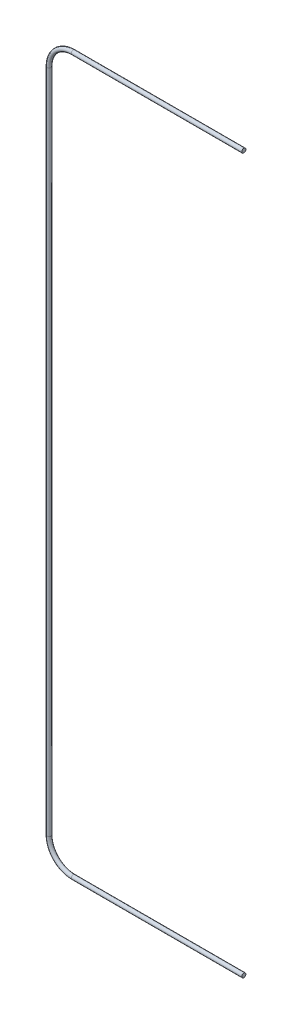
ISO-10303-21;
HEADER;
FILE_DESCRIPTION(('STEP AP214'),'2;1');
FILE_NAME('part.step','',(''),(''),'','','');
FILE_SCHEMA(('AUTOMOTIVE_DESIGN { 1 0 10303 214 1 1 1 1 }'));
ENDSEC;
DATA;
#1=APPLICATION_CONTEXT('core data for automotive mechanical design processes');
#2=APPLICATION_PROTOCOL_DEFINITION('international standard','automotive_design',2000,#1);
#3=PRODUCT_CONTEXT('',#1,'mechanical');
#4=PRODUCT('Part','Part','',(#3));
#5=PRODUCT_RELATED_PRODUCT_CATEGORY('part','',(#4));
#6=PRODUCT_DEFINITION_FORMATION('','',#4);
#7=PRODUCT_DEFINITION_CONTEXT('part definition',#1,'design');
#8=PRODUCT_DEFINITION('design','',#6,#7);
#9=PRODUCT_DEFINITION_SHAPE('','',#8);
#10=(LENGTH_UNIT() NAMED_UNIT(*) SI_UNIT(.MILLI.,.METRE.));
#11=(NAMED_UNIT(*) PLANE_ANGLE_UNIT() SI_UNIT($,.RADIAN.));
#12=(NAMED_UNIT(*) SI_UNIT($,.STERADIAN.) SOLID_ANGLE_UNIT());
#13=UNCERTAINTY_MEASURE_WITH_UNIT(LENGTH_MEASURE(1.E-05),#10,'distance_accuracy_value','');
#14=(GEOMETRIC_REPRESENTATION_CONTEXT(3) GLOBAL_UNCERTAINTY_ASSIGNED_CONTEXT((#13)) GLOBAL_UNIT_ASSIGNED_CONTEXT((#10,
#11,#12)) REPRESENTATION_CONTEXT('',''));
#15=CARTESIAN_POINT('',(0.,0.,0.));
#16=DIRECTION('',(0.,0.,1.));
#17=DIRECTION('',(1.,0.,0.));
#18=AXIS2_PLACEMENT_3D('',#15,#16,#17);
#19=CARTESIAN_POINT('',(599.999999999852,1099.99999999999,4.27435864480685E-11));
#20=DIRECTION('',(0.999999999999924,0.,0.));
#21=DIRECTION('',(0.,0.,0.99999999999992));
#22=AXIS2_PLACEMENT_3D('',#19,#20,#21);
#23=PLANE('',#22);
#24=CARTESIAN_POINT('',(599.999999999852,1099.99999999999,4.27435864480685E-11));
#25=DIRECTION('',(0.999999999999924,0.,0.));
#26=DIRECTION('',(0.,0.,0.99999999999992));
#27=AXIS2_PLACEMENT_3D('',#24,#25,#26);
#28=CIRCLE('',#27,6.35);
#29=CARTESIAN_POINT('',(599.999999999852,1099.99999999999,6.35000000004223));
#30=VERTEX_POINT('',#29);
#31=EDGE_CURVE('E77',#30,#30,#28,.T.);
#32=ORIENTED_EDGE('',*,*,#31,.T.);
#33=EDGE_LOOP('',(#32));
#34=FACE_BOUND('',#33,.T.);
#35=ADVANCED_FACE('F48',(#34),#23,.T.);
#36=CARTESIAN_POINT('',(599.999999999934,-1099.99999999999,-1.17350573702879E-10));
#37=DIRECTION('',(-0.999999999999924,0.,0.));
#38=DIRECTION('',(0.,0.,0.99999999999992));
#39=AXIS2_PLACEMENT_3D('',#36,#37,#38);
#40=PLANE('',#39);
#41=CARTESIAN_POINT('',(599.999999999934,-1099.99999999999,-1.17350573702879E-10));
#42=DIRECTION('',(-0.999999999999924,0.,0.));
#43=DIRECTION('',(0.,0.,0.99999999999992));
#44=AXIS2_PLACEMENT_3D('',#41,#42,#43);
#45=CIRCLE('',#44,6.35);
#46=CARTESIAN_POINT('',(599.999999999934,-1099.99999999999,6.34999999988214));
#47=VERTEX_POINT('',#46);
#48=EDGE_CURVE('E11',#47,#47,#45,.T.);
#49=ORIENTED_EDGE('',*,*,#48,.F.);
#50=EDGE_LOOP('',(#49));
#51=FACE_BOUND('',#50,.T.);
#52=ADVANCED_FACE('F87',(#51),#40,.F.);
#53=CARTESIAN_POINT('',(599.999999999852,1099.99999999999,4.27435864480685E-11));
#54=DIRECTION('',(-0.999999999999924,0.,0.));
#55=DIRECTION('',(0.,0.,0.99999999999992));
#56=AXIS2_PLACEMENT_3D('',#53,#54,#55);
#57=CYLINDRICAL_SURFACE('',#56,6.35);
#58=CARTESIAN_POINT('',(74.9999999998856,1099.99999999999,7.91589016557737E-11));
#59=DIRECTION('',(0.999999999999924,0.,0.));
#60=DIRECTION('',(0.,0.,0.99999999999992));
#61=AXIS2_PLACEMENT_3D('',#58,#59,#60);
#62=CIRCLE('',#61,6.35);
#63=CARTESIAN_POINT('',(74.9999999998851,1106.35000000001,8.06910834446281E-11));
#64=VERTEX_POINT('',#63);
#65=EDGE_CURVE('E73',#64,#64,#62,.T.);
#66=ORIENTED_EDGE('',*,*,#65,.T.);
#67=EDGE_LOOP('',(#66));
#68=FACE_BOUND('',#67,.T.);
#69=ORIENTED_EDGE('',*,*,#31,.F.);
#70=EDGE_LOOP('',(#69));
#71=FACE_BOUND('',#70,.T.);
#72=ADVANCED_FACE('F84',(#68,#71),#57,.T.);
#73=CARTESIAN_POINT('',(74.9999999998909,1025.00000000001,6.10622663543836E-11));
#74=DIRECTION('',(0.,0.,0.99999999999992));
#75=DIRECTION('',(0.999999999999924,0.,0.));
#76=AXIS2_PLACEMENT_3D('',#73,#74,#75);
#77=TOROIDAL_SURFACE('',#76,75.,6.35);
#78=CARTESIAN_POINT('',(-8.70414851306123E-11,1025.00000000001,5.57331958361829E-11));
#79=DIRECTION('',(0.,1.00000000000001,0.));
#80=DIRECTION('',(0.,0.,0.99999999999992));
#81=AXIS2_PLACEMENT_3D('',#78,#79,#80);
#82=CIRCLE('',#81,6.35);
#83=CARTESIAN_POINT('',(-6.35000000010902,1025.00000000001,5.52820011989735E-11));
#84=VERTEX_POINT('',#83);
#85=EDGE_CURVE('E67',#84,#84,#82,.T.);
#86=CARTESIAN_POINT('',(74.9999999998909,1025.00000000001,6.10622663543836E-11));
#87=DIRECTION('',(0.,0.,0.99999999999992));
#88=DIRECTION('',(0.999999999999924,0.,0.));
#89=AXIS2_PLACEMENT_3D('',#86,#87,#88);
#90=CIRCLE('',#89,81.35);
#91=EDGE_CURVE('',#64,#84,#90,.T.);
#92=ORIENTED_EDGE('',*,*,#65,.F.);
#93=ORIENTED_EDGE('',*,*,#85,.T.);
#94=ORIENTED_EDGE('',*,*,#91,.T.);
#95=ORIENTED_EDGE('',*,*,#91,.F.);
#96=EDGE_LOOP('',(#92,#94,#93,#95));
#97=FACE_BOUND('',#96,.T.);
#98=ADVANCED_FACE('F86',(#97),#77,.T.);
#99=CARTESIAN_POINT('',(-8.70414851306123E-11,1025.00000000001,5.57331958361829E-11));
#100=DIRECTION('',(0.,-1.00000000000001,0.));
#101=DIRECTION('',(0.,0.,-0.99999999999992));
#102=AXIS2_PLACEMENT_3D('',#99,#100,#101);
#103=CYLINDRICAL_SURFACE('',#102,6.35);
#104=CARTESIAN_POINT('',(-3.10862446895044E-11,-1024.99999999999,-8.58202398035246E-11));
#105=DIRECTION('',(0.,1.00000000000001,0.));
#106=DIRECTION('',(0.,0.,0.99999999999992));
#107=AXIS2_PLACEMENT_3D('',#104,#105,#106);
#108=CIRCLE('',#107,6.35);
#109=CARTESIAN_POINT('',(-6.35000000003623,-1024.99999999999,-8.58578393566253E-11));
#110=VERTEX_POINT('',#109);
#111=EDGE_CURVE('E61',#110,#110,#108,.T.);
#112=ORIENTED_EDGE('',*,*,#111,.T.);
#113=EDGE_LOOP('',(#112));
#114=FACE_BOUND('',#113,.T.);
#115=ORIENTED_EDGE('',*,*,#85,.F.);
#116=EDGE_LOOP('',(#115));
#117=FACE_BOUND('',#116,.T.);
#118=ADVANCED_FACE('F94',(#114,#117),#103,.T.);
#119=CARTESIAN_POINT('',(74.9999999999638,-1024.99999999999,-8.53761505936745E-11));
#120=DIRECTION('',(0.,0.,0.99999999999992));
#121=DIRECTION('',(0.999999999999924,0.,0.));
#122=AXIS2_PLACEMENT_3D('',#119,#120,#121);
#123=TOROIDAL_SURFACE('',#122,75.,6.35);
#124=CARTESIAN_POINT('',(74.9999999999762,-1099.99999999999,-9.78106484694763E-11));
#125=DIRECTION('',(-0.999999999999924,0.,0.));
#126=DIRECTION('',(0.,0.,0.99999999999992));
#127=AXIS2_PLACEMENT_3D('',#124,#125,#126);
#128=CIRCLE('',#127,6.35);
#129=CARTESIAN_POINT('',(74.9999999999772,-1106.34999999999,-9.88634359562928E-11));
#130=VERTEX_POINT('',#129);
#131=EDGE_CURVE('E55',#130,#130,#128,.T.);
#132=CARTESIAN_POINT('',(74.9999999999638,-1024.99999999999,-8.53761505936745E-11));
#133=DIRECTION('',(0.,0.,0.99999999999992));
#134=DIRECTION('',(0.999999999999924,0.,0.));
#135=AXIS2_PLACEMENT_3D('',#132,#133,#134);
#136=CIRCLE('',#135,81.35);
#137=EDGE_CURVE('',#110,#130,#136,.T.);
#138=ORIENTED_EDGE('',*,*,#111,.F.);
#139=ORIENTED_EDGE('',*,*,#131,.T.);
#140=ORIENTED_EDGE('',*,*,#137,.T.);
#141=ORIENTED_EDGE('',*,*,#137,.F.);
#142=EDGE_LOOP('',(#138,#140,#139,#141));
#143=FACE_BOUND('',#142,.T.);
#144=ADVANCED_FACE('F100',(#143),#123,.T.);
#145=CARTESIAN_POINT('',(74.9999999999815,-1099.99999999999,-9.6034291630076E-11));
#146=DIRECTION('',(0.999999999999924,0.,0.));
#147=DIRECTION('',(0.,0.,-0.99999999999992));
#148=AXIS2_PLACEMENT_3D('',#145,#146,#147);
#149=CYLINDRICAL_SURFACE('',#148,6.35);
#150=ORIENTED_EDGE('',*,*,#48,.T.);
#151=EDGE_LOOP('',(#150));
#152=FACE_BOUND('',#151,.T.);
#153=ORIENTED_EDGE('',*,*,#131,.F.);
#154=EDGE_LOOP('',(#153));
#155=FACE_BOUND('',#154,.T.);
#156=ADVANCED_FACE('F98',(#152,#155),#149,.T.);
#157=CLOSED_SHELL('',(#35,#52,#72,#98,#118,#144,#156));
#158=MANIFOLD_SOLID_BREP('B2',#157);
#159=ADVANCED_BREP_SHAPE_REPRESENTATION('',(#18,#158),#14);
#160=SHAPE_DEFINITION_REPRESENTATION(#9,#159);
ENDSEC;
END-ISO-10303-21;
